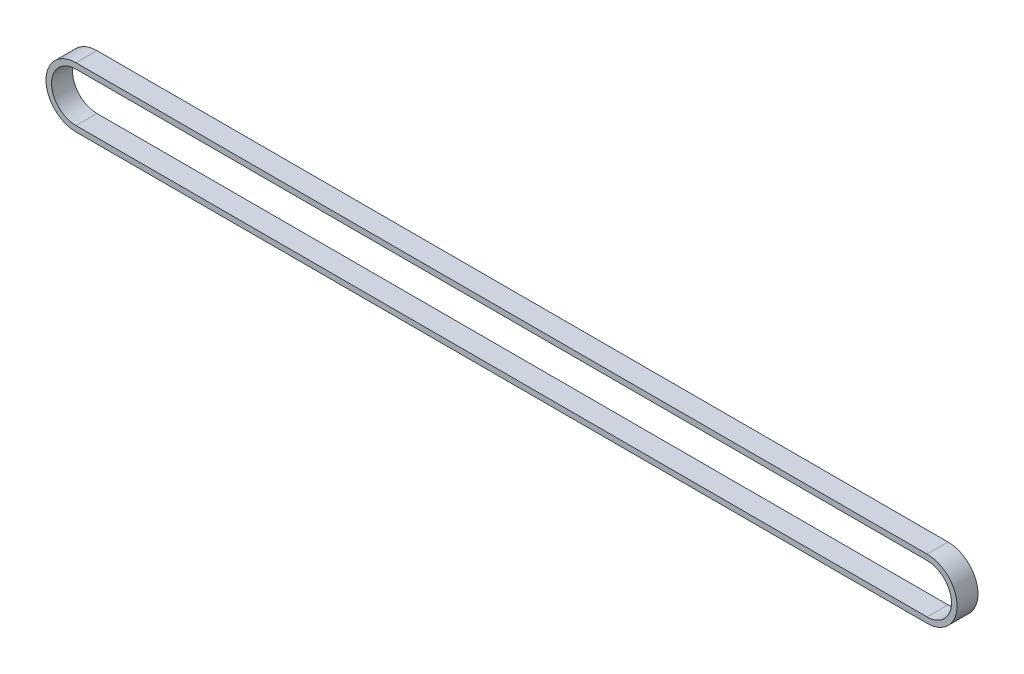
ISO-10303-21;
HEADER;
FILE_DESCRIPTION(('STEP AP214'),'2;1');
FILE_NAME('part.step','',(''),(''),'','','');
FILE_SCHEMA(('AUTOMOTIVE_DESIGN { 1 0 10303 214 1 1 1 1 }'));
ENDSEC;
DATA;
#1=APPLICATION_CONTEXT('core data for automotive mechanical design processes');
#2=APPLICATION_PROTOCOL_DEFINITION('international standard','automotive_design',2000,#1);
#3=PRODUCT_CONTEXT('',#1,'mechanical');
#4=PRODUCT('Part','Part','',(#3));
#5=PRODUCT_RELATED_PRODUCT_CATEGORY('part','',(#4));
#6=PRODUCT_DEFINITION_FORMATION('','',#4);
#7=PRODUCT_DEFINITION_CONTEXT('part definition',#1,'design');
#8=PRODUCT_DEFINITION('design','',#6,#7);
#9=PRODUCT_DEFINITION_SHAPE('','',#8);
#10=(LENGTH_UNIT() NAMED_UNIT(*) SI_UNIT(.MILLI.,.METRE.));
#11=(NAMED_UNIT(*) PLANE_ANGLE_UNIT() SI_UNIT($,.RADIAN.));
#12=(NAMED_UNIT(*) SI_UNIT($,.STERADIAN.) SOLID_ANGLE_UNIT());
#13=UNCERTAINTY_MEASURE_WITH_UNIT(LENGTH_MEASURE(1.E-05),#10,'distance_accuracy_value','');
#14=(GEOMETRIC_REPRESENTATION_CONTEXT(3) GLOBAL_UNCERTAINTY_ASSIGNED_CONTEXT((#13)) GLOBAL_UNIT_ASSIGNED_CONTEXT((#10,
#11,#12)) REPRESENTATION_CONTEXT('',''));
#15=CARTESIAN_POINT('',(0.,0.,0.));
#16=DIRECTION('',(0.,0.,1.));
#17=DIRECTION('',(1.,0.,0.));
#18=AXIS2_PLACEMENT_3D('',#15,#16,#17);
#19=CARTESIAN_POINT('',(0.,0.,15.));
#20=DIRECTION('',(0.,0.,1.));
#21=DIRECTION('',(1.,0.,0.));
#22=AXIS2_PLACEMENT_3D('',#19,#20,#21);
#23=PLANE('',#22);
#24=CARTESIAN_POINT('',(0.,0.,15.));
#25=DIRECTION('',(0.,0.,1.));
#26=DIRECTION('',(1.,0.,0.));
#27=AXIS2_PLACEMENT_3D('',#24,#25,#26);
#28=CIRCLE('',#27,21.5);
#29=CARTESIAN_POINT('',(0.,21.5,15.));
#30=VERTEX_POINT('',#29);
#31=CARTESIAN_POINT('',(0.,-21.5,15.));
#32=VERTEX_POINT('',#31);
#33=EDGE_CURVE('E142',#30,#32,#28,.T.);
#34=ORIENTED_EDGE('',*,*,#33,.T.);
#35=DIRECTION('',(1.,0.,0.));
#36=VECTOR('',#35,1.);
#37=CARTESIAN_POINT('',(0.,-21.5,15.));
#38=LINE('',#37,#36);
#39=CARTESIAN_POINT('',(610.,-21.5,15.));
#40=VERTEX_POINT('',#39);
#41=EDGE_CURVE('E145',#32,#40,#38,.T.);
#42=ORIENTED_EDGE('',*,*,#41,.T.);
#43=CARTESIAN_POINT('',(610.,0.,15.));
#44=DIRECTION('',(0.,0.,1.));
#45=DIRECTION('',(1.,0.,0.));
#46=AXIS2_PLACEMENT_3D('',#43,#44,#45);
#47=CIRCLE('',#46,21.5);
#48=CARTESIAN_POINT('',(610.,21.5,15.));
#49=VERTEX_POINT('',#48);
#50=EDGE_CURVE('E148',#40,#49,#47,.T.);
#51=ORIENTED_EDGE('',*,*,#50,.T.);
#52=DIRECTION('',(-1.,0.,0.));
#53=VECTOR('',#52,1.);
#54=CARTESIAN_POINT('',(0.,21.5,15.));
#55=LINE('',#54,#53);
#56=EDGE_CURVE('E150',#49,#30,#55,.T.);
#57=ORIENTED_EDGE('',*,*,#56,.T.);
#58=EDGE_LOOP('',(#34,#42,#51,#57));
#59=FACE_BOUND('',#58,.T.);
#60=DIRECTION('',(1.,0.,0.));
#61=VECTOR('',#60,1.);
#62=CARTESIAN_POINT('',(0.,-17.5,15.));
#63=LINE('',#62,#61);
#64=CARTESIAN_POINT('',(0.,-17.5,15.));
#65=VERTEX_POINT('',#64);
#66=CARTESIAN_POINT('',(610.,-17.5,15.));
#67=VERTEX_POINT('',#66);
#68=EDGE_CURVE('E114',#65,#67,#63,.T.);
#69=ORIENTED_EDGE('',*,*,#68,.F.);
#70=CARTESIAN_POINT('',(0.,0.,15.));
#71=DIRECTION('',(0.,0.,1.));
#72=DIRECTION('',(1.,0.,0.));
#73=AXIS2_PLACEMENT_3D('',#70,#71,#72);
#74=CIRCLE('',#73,17.5);
#75=CARTESIAN_POINT('',(0.,17.5,15.));
#76=VERTEX_POINT('',#75);
#77=EDGE_CURVE('E106',#76,#65,#74,.T.);
#78=ORIENTED_EDGE('',*,*,#77,.F.);
#79=DIRECTION('',(-1.,0.,0.));
#80=VECTOR('',#79,1.);
#81=CARTESIAN_POINT('',(0.,17.5,15.));
#82=LINE('',#81,#80);
#83=CARTESIAN_POINT('',(610.,17.5,15.));
#84=VERTEX_POINT('',#83);
#85=EDGE_CURVE('E128',#84,#76,#82,.T.);
#86=ORIENTED_EDGE('',*,*,#85,.F.);
#87=CARTESIAN_POINT('',(610.,0.,15.));
#88=DIRECTION('',(0.,0.,1.));
#89=DIRECTION('',(1.,0.,0.));
#90=AXIS2_PLACEMENT_3D('',#87,#88,#89);
#91=CIRCLE('',#90,17.5);
#92=EDGE_CURVE('E126',#67,#84,#91,.T.);
#93=ORIENTED_EDGE('',*,*,#92,.F.);
#94=EDGE_LOOP('',(#69,#78,#86,#93));
#95=FACE_BOUND('',#94,.T.);
#96=ADVANCED_FACE('F41',(#59,#95),#23,.T.);
#97=CARTESIAN_POINT('',(0.,0.,0.));
#98=DIRECTION('',(0.,0.,1.));
#99=DIRECTION('',(1.,0.,0.));
#100=AXIS2_PLACEMENT_3D('',#97,#98,#99);
#101=PLANE('',#100);
#102=CARTESIAN_POINT('',(0.,0.,0.));
#103=DIRECTION('',(0.,0.,1.));
#104=DIRECTION('',(1.,0.,0.));
#105=AXIS2_PLACEMENT_3D('',#102,#103,#104);
#106=CIRCLE('',#105,21.5);
#107=CARTESIAN_POINT('',(0.,21.5,0.));
#108=VERTEX_POINT('',#107);
#109=CARTESIAN_POINT('',(0.,-21.5,0.));
#110=VERTEX_POINT('',#109);
#111=EDGE_CURVE('E122',#108,#110,#106,.T.);
#112=ORIENTED_EDGE('',*,*,#111,.F.);
#113=DIRECTION('',(-1.,0.,0.));
#114=VECTOR('',#113,1.);
#115=CARTESIAN_POINT('',(0.,21.5,0.));
#116=LINE('',#115,#114);
#117=CARTESIAN_POINT('',(610.,21.5,0.));
#118=VERTEX_POINT('',#117);
#119=EDGE_CURVE('E146',#118,#108,#116,.T.);
#120=ORIENTED_EDGE('',*,*,#119,.F.);
#121=CARTESIAN_POINT('',(610.,0.,0.));
#122=DIRECTION('',(0.,0.,1.));
#123=DIRECTION('',(1.,0.,0.));
#124=AXIS2_PLACEMENT_3D('',#121,#122,#123);
#125=CIRCLE('',#124,21.5);
#126=CARTESIAN_POINT('',(610.,-21.5,0.));
#127=VERTEX_POINT('',#126);
#128=EDGE_CURVE('E157',#127,#118,#125,.T.);
#129=ORIENTED_EDGE('',*,*,#128,.F.);
#130=DIRECTION('',(1.,0.,0.));
#131=VECTOR('',#130,1.);
#132=CARTESIAN_POINT('',(0.,-21.5,0.));
#133=LINE('',#132,#131);
#134=EDGE_CURVE('E155',#110,#127,#133,.T.);
#135=ORIENTED_EDGE('',*,*,#134,.F.);
#136=EDGE_LOOP('',(#112,#120,#129,#135));
#137=FACE_BOUND('',#136,.T.);
#138=CARTESIAN_POINT('',(0.,0.,0.));
#139=DIRECTION('',(0.,0.,1.));
#140=DIRECTION('',(1.,0.,0.));
#141=AXIS2_PLACEMENT_3D('',#138,#139,#140);
#142=CIRCLE('',#141,17.5);
#143=CARTESIAN_POINT('',(0.,17.5,0.));
#144=VERTEX_POINT('',#143);
#145=CARTESIAN_POINT('',(0.,-17.5,0.));
#146=VERTEX_POINT('',#145);
#147=EDGE_CURVE('E64',#144,#146,#142,.T.);
#148=ORIENTED_EDGE('',*,*,#147,.T.);
#149=DIRECTION('',(1.,0.,0.));
#150=VECTOR('',#149,1.);
#151=CARTESIAN_POINT('',(0.,-17.5,0.));
#152=LINE('',#151,#150);
#153=CARTESIAN_POINT('',(610.,-17.5,0.));
#154=VERTEX_POINT('',#153);
#155=EDGE_CURVE('E121',#146,#154,#152,.T.);
#156=ORIENTED_EDGE('',*,*,#155,.T.);
#157=CARTESIAN_POINT('',(610.,0.,0.));
#158=DIRECTION('',(0.,0.,1.));
#159=DIRECTION('',(1.,0.,0.));
#160=AXIS2_PLACEMENT_3D('',#157,#158,#159);
#161=CIRCLE('',#160,17.5);
#162=CARTESIAN_POINT('',(610.,17.5,0.));
#163=VERTEX_POINT('',#162);
#164=EDGE_CURVE('E134',#154,#163,#161,.T.);
#165=ORIENTED_EDGE('',*,*,#164,.T.);
#166=DIRECTION('',(-1.,0.,0.));
#167=VECTOR('',#166,1.);
#168=CARTESIAN_POINT('',(0.,17.5,0.));
#169=LINE('',#168,#167);
#170=EDGE_CURVE('E115',#163,#144,#169,.T.);
#171=ORIENTED_EDGE('',*,*,#170,.T.);
#172=EDGE_LOOP('',(#148,#156,#165,#171));
#173=FACE_BOUND('',#172,.T.);
#174=ADVANCED_FACE('F175',(#137,#173),#101,.F.);
#175=CARTESIAN_POINT('',(0.,0.,15.));
#176=DIRECTION('',(0.,0.,-1.));
#177=DIRECTION('',(-1.,0.,0.));
#178=AXIS2_PLACEMENT_3D('',#175,#176,#177);
#179=CYLINDRICAL_SURFACE('',#178,21.5);
#180=ORIENTED_EDGE('',*,*,#111,.T.);
#181=DIRECTION('',(0.,0.,-1.));
#182=VECTOR('',#181,1.);
#183=CARTESIAN_POINT('',(0.,-21.5,15.));
#184=LINE('',#183,#182);
#185=EDGE_CURVE('E11',#32,#110,#184,.T.);
#186=ORIENTED_EDGE('',*,*,#185,.F.);
#187=ORIENTED_EDGE('',*,*,#33,.F.);
#188=DIRECTION('',(0.,0.,-1.));
#189=VECTOR('',#188,1.);
#190=CARTESIAN_POINT('',(0.,21.5,15.));
#191=LINE('',#190,#189);
#192=EDGE_CURVE('E152',#30,#108,#191,.T.);
#193=ORIENTED_EDGE('',*,*,#192,.T.);
#194=EDGE_LOOP('',(#180,#186,#187,#193));
#195=FACE_BOUND('',#194,.T.);
#196=ADVANCED_FACE('F43',(#195),#179,.T.);
#197=CARTESIAN_POINT('',(0.,-21.5,15.));
#198=DIRECTION('',(0.,1.,0.));
#199=DIRECTION('',(0.,0.,1.));
#200=AXIS2_PLACEMENT_3D('',#197,#198,#199);
#201=PLANE('',#200);
#202=ORIENTED_EDGE('',*,*,#134,.T.);
#203=DIRECTION('',(0.,0.,-1.));
#204=VECTOR('',#203,1.);
#205=CARTESIAN_POINT('',(610.,-21.5,15.));
#206=LINE('',#205,#204);
#207=EDGE_CURVE('E49',#40,#127,#206,.T.);
#208=ORIENTED_EDGE('',*,*,#207,.F.);
#209=ORIENTED_EDGE('',*,*,#41,.F.);
#210=ORIENTED_EDGE('',*,*,#185,.T.);
#211=EDGE_LOOP('',(#202,#208,#209,#210));
#212=FACE_BOUND('',#211,.T.);
#213=ADVANCED_FACE('F185',(#212),#201,.F.);
#214=CARTESIAN_POINT('',(610.,0.,15.));
#215=DIRECTION('',(0.,0.,-1.));
#216=DIRECTION('',(-1.,0.,0.));
#217=AXIS2_PLACEMENT_3D('',#214,#215,#216);
#218=CYLINDRICAL_SURFACE('',#217,21.5);
#219=ORIENTED_EDGE('',*,*,#128,.T.);
#220=DIRECTION('',(0.,0.,-1.));
#221=VECTOR('',#220,1.);
#222=CARTESIAN_POINT('',(610.,21.5,15.));
#223=LINE('',#222,#221);
#224=EDGE_CURVE('E162',#49,#118,#223,.T.);
#225=ORIENTED_EDGE('',*,*,#224,.F.);
#226=ORIENTED_EDGE('',*,*,#50,.F.);
#227=ORIENTED_EDGE('',*,*,#207,.T.);
#228=EDGE_LOOP('',(#219,#225,#226,#227));
#229=FACE_BOUND('',#228,.T.);
#230=ADVANCED_FACE('F169',(#229),#218,.T.);
#231=CARTESIAN_POINT('',(0.,21.5,15.));
#232=DIRECTION('',(0.,-1.,0.));
#233=DIRECTION('',(0.,0.,-1.));
#234=AXIS2_PLACEMENT_3D('',#231,#232,#233);
#235=PLANE('',#234);
#236=ORIENTED_EDGE('',*,*,#119,.T.);
#237=ORIENTED_EDGE('',*,*,#192,.F.);
#238=ORIENTED_EDGE('',*,*,#56,.F.);
#239=ORIENTED_EDGE('',*,*,#224,.T.);
#240=EDGE_LOOP('',(#236,#237,#238,#239));
#241=FACE_BOUND('',#240,.T.);
#242=ADVANCED_FACE('F179',(#241),#235,.F.);
#243=CARTESIAN_POINT('',(0.,0.,15.));
#244=DIRECTION('',(0.,0.,-1.));
#245=DIRECTION('',(-1.,0.,0.));
#246=AXIS2_PLACEMENT_3D('',#243,#244,#245);
#247=CYLINDRICAL_SURFACE('',#246,17.5);
#248=ORIENTED_EDGE('',*,*,#147,.F.);
#249=DIRECTION('',(0.,0.,-1.));
#250=VECTOR('',#249,1.);
#251=CARTESIAN_POINT('',(0.,17.5,15.));
#252=LINE('',#251,#250);
#253=EDGE_CURVE('E110',#76,#144,#252,.T.);
#254=ORIENTED_EDGE('',*,*,#253,.F.);
#255=ORIENTED_EDGE('',*,*,#77,.T.);
#256=DIRECTION('',(0.,0.,-1.));
#257=VECTOR('',#256,1.);
#258=CARTESIAN_POINT('',(0.,-17.5,15.));
#259=LINE('',#258,#257);
#260=EDGE_CURVE('E109',#65,#146,#259,.T.);
#261=ORIENTED_EDGE('',*,*,#260,.T.);
#262=EDGE_LOOP('',(#248,#254,#255,#261));
#263=FACE_BOUND('',#262,.T.);
#264=ADVANCED_FACE('F108',(#263),#247,.F.);
#265=CARTESIAN_POINT('',(0.,-17.5,15.));
#266=DIRECTION('',(0.,1.,0.));
#267=DIRECTION('',(-1.,0.,0.));
#268=AXIS2_PLACEMENT_3D('',#265,#266,#267);
#269=PLANE('',#268);
#270=ORIENTED_EDGE('',*,*,#155,.F.);
#271=ORIENTED_EDGE('',*,*,#260,.F.);
#272=ORIENTED_EDGE('',*,*,#68,.T.);
#273=DIRECTION('',(0.,0.,-1.));
#274=VECTOR('',#273,1.);
#275=CARTESIAN_POINT('',(610.,-17.5,15.));
#276=LINE('',#275,#274);
#277=EDGE_CURVE('E123',#67,#154,#276,.T.);
#278=ORIENTED_EDGE('',*,*,#277,.T.);
#279=EDGE_LOOP('',(#270,#271,#272,#278));
#280=FACE_BOUND('',#279,.T.);
#281=ADVANCED_FACE('F118',(#280),#269,.T.);
#282=CARTESIAN_POINT('',(610.,0.,15.));
#283=DIRECTION('',(0.,0.,-1.));
#284=DIRECTION('',(-1.,0.,0.));
#285=AXIS2_PLACEMENT_3D('',#282,#283,#284);
#286=CYLINDRICAL_SURFACE('',#285,17.5);
#287=ORIENTED_EDGE('',*,*,#164,.F.);
#288=ORIENTED_EDGE('',*,*,#277,.F.);
#289=ORIENTED_EDGE('',*,*,#92,.T.);
#290=DIRECTION('',(0.,0.,-1.));
#291=VECTOR('',#290,1.);
#292=CARTESIAN_POINT('',(610.,17.5,15.));
#293=LINE('',#292,#291);
#294=EDGE_CURVE('E56',#84,#163,#293,.T.);
#295=ORIENTED_EDGE('',*,*,#294,.T.);
#296=EDGE_LOOP('',(#287,#288,#289,#295));
#297=FACE_BOUND('',#296,.T.);
#298=ADVANCED_FACE('F208',(#297),#286,.F.);
#299=CARTESIAN_POINT('',(0.,17.5,15.));
#300=DIRECTION('',(0.,-1.,0.));
#301=DIRECTION('',(1.,0.,0.));
#302=AXIS2_PLACEMENT_3D('',#299,#300,#301);
#303=PLANE('',#302);
#304=ORIENTED_EDGE('',*,*,#170,.F.);
#305=ORIENTED_EDGE('',*,*,#294,.F.);
#306=ORIENTED_EDGE('',*,*,#85,.T.);
#307=ORIENTED_EDGE('',*,*,#253,.T.);
#308=EDGE_LOOP('',(#304,#305,#306,#307));
#309=FACE_BOUND('',#308,.T.);
#310=ADVANCED_FACE('F212',(#309),#303,.T.);
#311=CLOSED_SHELL('',(#96,#174,#196,#213,#230,#242,#264,#281,#298,#310));
#312=MANIFOLD_SOLID_BREP('B2',#311);
#313=ADVANCED_BREP_SHAPE_REPRESENTATION('',(#18,#312),#14);
#314=SHAPE_DEFINITION_REPRESENTATION(#9,#313);
ENDSEC;
END-ISO-10303-21;
